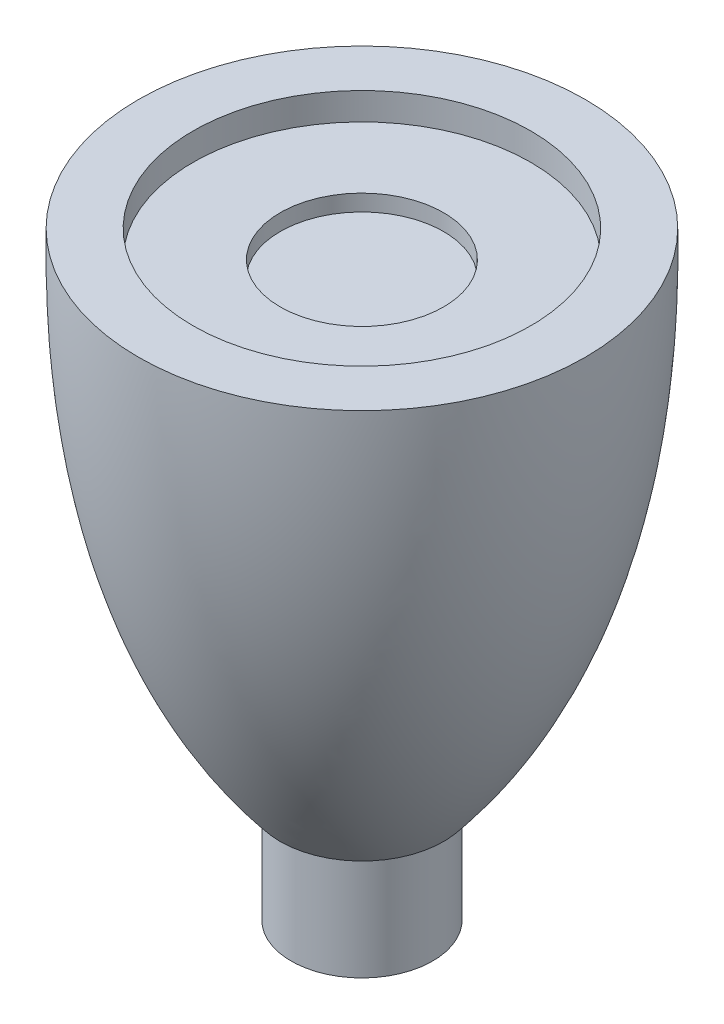
ISO-10303-21;
HEADER;
FILE_DESCRIPTION(('STEP AP214'),'2;1');
FILE_NAME('part.step','',(''),(''),'','','');
FILE_SCHEMA(('AUTOMOTIVE_DESIGN { 1 0 10303 214 1 1 1 1 }'));
ENDSEC;
DATA;
#1=APPLICATION_CONTEXT('core data for automotive mechanical design processes');
#2=APPLICATION_PROTOCOL_DEFINITION('international standard','automotive_design',2000,#1);
#3=PRODUCT_CONTEXT('',#1,'mechanical');
#4=PRODUCT('Part','Part','',(#3));
#5=PRODUCT_RELATED_PRODUCT_CATEGORY('part','',(#4));
#6=PRODUCT_DEFINITION_FORMATION('','',#4);
#7=PRODUCT_DEFINITION_CONTEXT('part definition',#1,'design');
#8=PRODUCT_DEFINITION('design','',#6,#7);
#9=PRODUCT_DEFINITION_SHAPE('','',#8);
#10=(LENGTH_UNIT() NAMED_UNIT(*) SI_UNIT(.MILLI.,.METRE.));
#11=(NAMED_UNIT(*) PLANE_ANGLE_UNIT() SI_UNIT($,.RADIAN.));
#12=(NAMED_UNIT(*) SI_UNIT($,.STERADIAN.) SOLID_ANGLE_UNIT());
#13=UNCERTAINTY_MEASURE_WITH_UNIT(LENGTH_MEASURE(1.E-05),#10,'distance_accuracy_value','');
#14=(GEOMETRIC_REPRESENTATION_CONTEXT(3) GLOBAL_UNCERTAINTY_ASSIGNED_CONTEXT((#13)) GLOBAL_UNIT_ASSIGNED_CONTEXT((#10,
#11,#12)) REPRESENTATION_CONTEXT('',''));
#15=CARTESIAN_POINT('',(0.,0.,0.));
#16=DIRECTION('',(0.,0.,1.));
#17=DIRECTION('',(1.,0.,0.));
#18=AXIS2_PLACEMENT_3D('',#15,#16,#17);
#19=CARTESIAN_POINT('',(-20.5,45.,0.));
#20=DIRECTION('',(0.,1.,0.));
#21=DIRECTION('',(0.,0.,1.));
#22=AXIS2_PLACEMENT_3D('',#19,#20,#21);
#23=PLANE('',#22);
#24=CARTESIAN_POINT('',(0.,45.,0.));
#25=DIRECTION('',(0.,1.,0.));
#26=DIRECTION('',(0.,0.,1.));
#27=AXIS2_PLACEMENT_3D('',#24,#25,#26);
#28=CIRCLE('',#27,15.5);
#29=CARTESIAN_POINT('',(0.,45.,15.5));
#30=VERTEX_POINT('',#29);
#31=EDGE_CURVE('E63',#30,#30,#28,.T.);
#32=ORIENTED_EDGE('',*,*,#31,.F.);
#33=EDGE_LOOP('',(#32));
#34=FACE_BOUND('',#33,.T.);
#35=CARTESIAN_POINT('',(0.,45.,0.));
#36=DIRECTION('',(0.,1.,0.));
#37=DIRECTION('',(0.,0.,1.));
#38=AXIS2_PLACEMENT_3D('',#35,#36,#37);
#39=CIRCLE('',#38,20.5);
#40=CARTESIAN_POINT('',(0.,45.,20.5));
#41=VERTEX_POINT('',#40);
#42=EDGE_CURVE('E52',#41,#41,#39,.T.);
#43=ORIENTED_EDGE('',*,*,#42,.T.);
#44=EDGE_LOOP('',(#43));
#45=FACE_BOUND('',#44,.T.);
#46=ADVANCED_FACE('F40',(#34,#45),#23,.T.);
#47=CARTESIAN_POINT('',(-7.50000000000001,0.,0.));
#48=DIRECTION('',(0.,-1.,0.));
#49=DIRECTION('',(0.,0.,-1.));
#50=AXIS2_PLACEMENT_3D('',#47,#48,#49);
#51=PLANE('',#50);
#52=CARTESIAN_POINT('',(0.,0.,0.));
#53=DIRECTION('',(0.,-1.,0.));
#54=DIRECTION('',(0.,0.,-1.));
#55=AXIS2_PLACEMENT_3D('',#52,#53,#54);
#56=CIRCLE('',#55,6.5);
#57=CARTESIAN_POINT('',(0.,0.,-6.5));
#58=VERTEX_POINT('',#57);
#59=EDGE_CURVE('E10',#58,#58,#56,.T.);
#60=ORIENTED_EDGE('',*,*,#59,.F.);
#61=EDGE_LOOP('',(#60));
#62=FACE_BOUND('',#61,.T.);
#63=CARTESIAN_POINT('',(0.,0.,0.));
#64=DIRECTION('',(0.,1.,0.));
#65=DIRECTION('',(0.,0.,1.));
#66=AXIS2_PLACEMENT_3D('',#63,#64,#65);
#67=CIRCLE('',#66,7.50000000000001);
#68=CARTESIAN_POINT('',(0.,0.,7.50000000000001));
#69=VERTEX_POINT('',#68);
#70=EDGE_CURVE('E47',#69,#69,#67,.T.);
#71=ORIENTED_EDGE('',*,*,#70,.F.);
#72=EDGE_LOOP('',(#71));
#73=FACE_BOUND('',#72,.T.);
#74=ADVANCED_FACE('F78',(#62,#73),#51,.T.);
#75=CARTESIAN_POINT('',(-20.5,45.,0.));
#76=CARTESIAN_POINT('',(-20.9454828319335,16.4460985887183,0.));
#77=CARTESIAN_POINT('',(-7.50000000000001,0.,0.));
#78=B_SPLINE_CURVE_WITH_KNOTS('',2,(#75,#76,#77),.UNSPECIFIED.,.F.,.F.,(3,3),(0.,
0.557031676303154),.UNSPECIFIED.);
#79=CARTESIAN_POINT('',(0.,45.,0.));
#80=DIRECTION('',(0.,1.,0.));
#81=AXIS1_PLACEMENT('',#79,#80);
#82=SURFACE_OF_REVOLUTION('',#78,#81);
#83=ORIENTED_EDGE('',*,*,#70,.T.);
#84=EDGE_LOOP('',(#83));
#85=FACE_BOUND('',#84,.T.);
#86=ORIENTED_EDGE('',*,*,#42,.F.);
#87=EDGE_LOOP('',(#86));
#88=FACE_BOUND('',#87,.T.);
#89=ADVANCED_FACE('F74',(#85,#88),#82,.F.);
#90=CARTESIAN_POINT('',(0.,42.5,0.));
#91=DIRECTION('',(0.,1.,0.));
#92=DIRECTION('',(0.,0.,1.));
#93=AXIS2_PLACEMENT_3D('',#90,#91,#92);
#94=CYLINDRICAL_SURFACE('',#93,15.5);
#95=CARTESIAN_POINT('',(0.,42.5,0.));
#96=DIRECTION('',(0.,1.,0.));
#97=DIRECTION('',(0.,0.,1.));
#98=AXIS2_PLACEMENT_3D('',#95,#96,#97);
#99=CIRCLE('',#98,15.5);
#100=CARTESIAN_POINT('',(0.,42.5,15.5));
#101=VERTEX_POINT('',#100);
#102=EDGE_CURVE('E60',#101,#101,#99,.T.);
#103=ORIENTED_EDGE('',*,*,#102,.F.);
#104=EDGE_LOOP('',(#103));
#105=FACE_BOUND('',#104,.T.);
#106=ORIENTED_EDGE('',*,*,#31,.T.);
#107=EDGE_LOOP('',(#106));
#108=FACE_BOUND('',#107,.T.);
#109=ADVANCED_FACE('F77',(#105,#108),#94,.F.);
#110=CARTESIAN_POINT('',(0.,42.5,0.));
#111=DIRECTION('',(0.,1.,0.));
#112=DIRECTION('',(0.,0.,1.));
#113=AXIS2_PLACEMENT_3D('',#110,#111,#112);
#114=PLANE('',#113);
#115=CARTESIAN_POINT('',(0.,42.5,0.));
#116=DIRECTION('',(0.,1.,0.));
#117=DIRECTION('',(0.,0.,1.));
#118=AXIS2_PLACEMENT_3D('',#115,#116,#117);
#119=CIRCLE('',#118,7.5);
#120=CARTESIAN_POINT('',(0.,42.5,7.5));
#121=VERTEX_POINT('',#120);
#122=EDGE_CURVE('E43',#121,#121,#119,.T.);
#123=ORIENTED_EDGE('',*,*,#122,.F.);
#124=EDGE_LOOP('',(#123));
#125=FACE_BOUND('',#124,.T.);
#126=ORIENTED_EDGE('',*,*,#102,.T.);
#127=EDGE_LOOP('',(#126));
#128=FACE_BOUND('',#127,.T.);
#129=ADVANCED_FACE('F102',(#125,#128),#114,.T.);
#130=CARTESIAN_POINT('',(0.,41.,0.));
#131=DIRECTION('',(0.,1.,0.));
#132=DIRECTION('',(0.,0.,1.));
#133=AXIS2_PLACEMENT_3D('',#130,#131,#132);
#134=CYLINDRICAL_SURFACE('',#133,7.5);
#135=ORIENTED_EDGE('',*,*,#122,.T.);
#136=EDGE_LOOP('',(#135));
#137=FACE_BOUND('',#136,.T.);
#138=CARTESIAN_POINT('',(0.,41.,0.));
#139=DIRECTION('',(0.,1.,0.));
#140=DIRECTION('',(0.,0.,1.));
#141=AXIS2_PLACEMENT_3D('',#138,#139,#140);
#142=CIRCLE('',#141,7.5);
#143=CARTESIAN_POINT('',(0.,41.,7.5));
#144=VERTEX_POINT('',#143);
#145=EDGE_CURVE('E57',#144,#144,#142,.T.);
#146=ORIENTED_EDGE('',*,*,#145,.F.);
#147=EDGE_LOOP('',(#146));
#148=FACE_BOUND('',#147,.T.);
#149=ADVANCED_FACE('F106',(#137,#148),#134,.F.);
#150=CARTESIAN_POINT('',(0.,41.,0.));
#151=DIRECTION('',(0.,1.,0.));
#152=DIRECTION('',(0.,0.,1.));
#153=AXIS2_PLACEMENT_3D('',#150,#151,#152);
#154=PLANE('',#153);
#155=ORIENTED_EDGE('',*,*,#145,.T.);
#156=EDGE_LOOP('',(#155));
#157=FACE_BOUND('',#156,.T.);
#158=ADVANCED_FACE('F113',(#157),#154,.T.);
#159=CARTESIAN_POINT('',(0.,-10.,0.));
#160=DIRECTION('',(0.,1.,0.));
#161=DIRECTION('',(0.,0.,1.));
#162=AXIS2_PLACEMENT_3D('',#159,#160,#161);
#163=CYLINDRICAL_SURFACE('',#162,6.5);
#164=CARTESIAN_POINT('',(0.,-10.,0.));
#165=DIRECTION('',(0.,-1.,0.));
#166=DIRECTION('',(0.,0.,-1.));
#167=AXIS2_PLACEMENT_3D('',#164,#165,#166);
#168=CIRCLE('',#167,6.5);
#169=CARTESIAN_POINT('',(0.,-10.,-6.5));
#170=VERTEX_POINT('',#169);
#171=EDGE_CURVE('E55',#170,#170,#168,.T.);
#172=ORIENTED_EDGE('',*,*,#171,.F.);
#173=EDGE_LOOP('',(#172));
#174=FACE_BOUND('',#173,.T.);
#175=ORIENTED_EDGE('',*,*,#59,.T.);
#176=EDGE_LOOP('',(#175));
#177=FACE_BOUND('',#176,.T.);
#178=ADVANCED_FACE('F120',(#174,#177),#163,.T.);
#179=CARTESIAN_POINT('',(0.,-10.,0.));
#180=DIRECTION('',(0.,-1.,0.));
#181=DIRECTION('',(0.,0.,-1.));
#182=AXIS2_PLACEMENT_3D('',#179,#180,#181);
#183=PLANE('',#182);
#184=CARTESIAN_POINT('',(0.,-10.,0.));
#185=DIRECTION('',(0.,1.,0.));
#186=DIRECTION('',(-1.,0.,0.));
#187=AXIS2_PLACEMENT_3D('',#184,#185,#186);
#188=CIRCLE('',#187,2.5);
#189=CARTESIAN_POINT('',(-2.5,-10.,0.));
#190=VERTEX_POINT('',#189);
#191=EDGE_CURVE('E151',#190,#190,#188,.T.);
#192=ORIENTED_EDGE('',*,*,#191,.T.);
#193=EDGE_LOOP('',(#192));
#194=FACE_BOUND('',#193,.T.);
#195=ORIENTED_EDGE('',*,*,#171,.T.);
#196=EDGE_LOOP('',(#195));
#197=FACE_BOUND('',#196,.T.);
#198=ADVANCED_FACE('F124',(#194,#197),#183,.T.);
#199=CARTESIAN_POINT('',(0.,36.0000000000026,0.));
#200=DIRECTION('',(0.,1.,0.));
#201=DIRECTION('',(-1.,0.,0.));
#202=AXIS2_PLACEMENT_3D('',#199,#200,#201);
#203=CYLINDRICAL_SURFACE('',#202,2.5);
#204=ORIENTED_EDGE('',*,*,#191,.F.);
#205=EDGE_LOOP('',(#204));
#206=FACE_BOUND('',#205,.T.);
#207=CARTESIAN_POINT('',(0.,0.,0.));
#208=DIRECTION('',(0.,1.,0.));
#209=DIRECTION('',(-1.,0.,0.));
#210=AXIS2_PLACEMENT_3D('',#207,#208,#209);
#211=CIRCLE('',#210,2.5);
#212=CARTESIAN_POINT('',(-2.5,0.,0.));
#213=VERTEX_POINT('',#212);
#214=EDGE_CURVE('E149',#213,#213,#211,.T.);
#215=ORIENTED_EDGE('',*,*,#214,.T.);
#216=EDGE_LOOP('',(#215));
#217=FACE_BOUND('',#216,.T.);
#218=ADVANCED_FACE('F128',(#206,#217),#203,.F.);
#219=CARTESIAN_POINT('',(-15.2752596867655,36.0000000000026,0.));
#220=CARTESIAN_POINT('',(-14.2587869103313,21.1742168665789,0.));
#221=CARTESIAN_POINT('',(-10.0003670147429,9.17421686657975,0.));
#222=CARTESIAN_POINT('',(-2.5,0.,0.));
#223=B_SPLINE_CURVE_WITH_KNOTS('',3,(#219,#220,#221,#222),.UNSPECIFIED.,.F.,.F.,(4,4),
(0.0909336495530425,0.557031676303154),.UNSPECIFIED.);
#224=CARTESIAN_POINT('',(0.,36.0000000000026,0.));
#225=DIRECTION('',(0.,1.,0.));
#226=AXIS1_PLACEMENT('',#224,#225);
#227=SURFACE_OF_REVOLUTION('',#223,#226);
#228=ORIENTED_EDGE('',*,*,#214,.F.);
#229=EDGE_LOOP('',(#228));
#230=FACE_BOUND('',#229,.T.);
#231=CARTESIAN_POINT('',(0.,36.0000000000026,0.));
#232=DIRECTION('',(0.,1.,0.));
#233=DIRECTION('',(-1.,0.,0.));
#234=AXIS2_PLACEMENT_3D('',#231,#232,#233);
#235=CIRCLE('',#234,15.2752596867655);
#236=CARTESIAN_POINT('',(-15.2752596867655,36.0000000000026,0.));
#237=VERTEX_POINT('',#236);
#238=EDGE_CURVE('E143',#237,#237,#235,.T.);
#239=ORIENTED_EDGE('',*,*,#238,.T.);
#240=EDGE_LOOP('',(#239));
#241=FACE_BOUND('',#240,.T.);
#242=ADVANCED_FACE('F132',(#230,#241),#227,.T.);
#243=CARTESIAN_POINT('',(0.,36.0000000000026,0.));
#244=DIRECTION('',(0.,1.,0.));
#245=DIRECTION('',(-1.,0.,0.));
#246=AXIS2_PLACEMENT_3D('',#243,#244,#245);
#247=PLANE('',#246);
#248=ORIENTED_EDGE('',*,*,#238,.F.);
#249=EDGE_LOOP('',(#248));
#250=FACE_BOUND('',#249,.T.);
#251=ADVANCED_FACE('F137',(#250),#247,.F.);
#252=CLOSED_SHELL('',(#46,#74,#89,#109,#129,#149,#158,#178,#198,#218,#242,#251));
#253=MANIFOLD_SOLID_BREP('B2',#252);
#254=ADVANCED_BREP_SHAPE_REPRESENTATION('',(#18,#253),#14);
#255=SHAPE_DEFINITION_REPRESENTATION(#9,#254);
ENDSEC;
END-ISO-10303-21;
